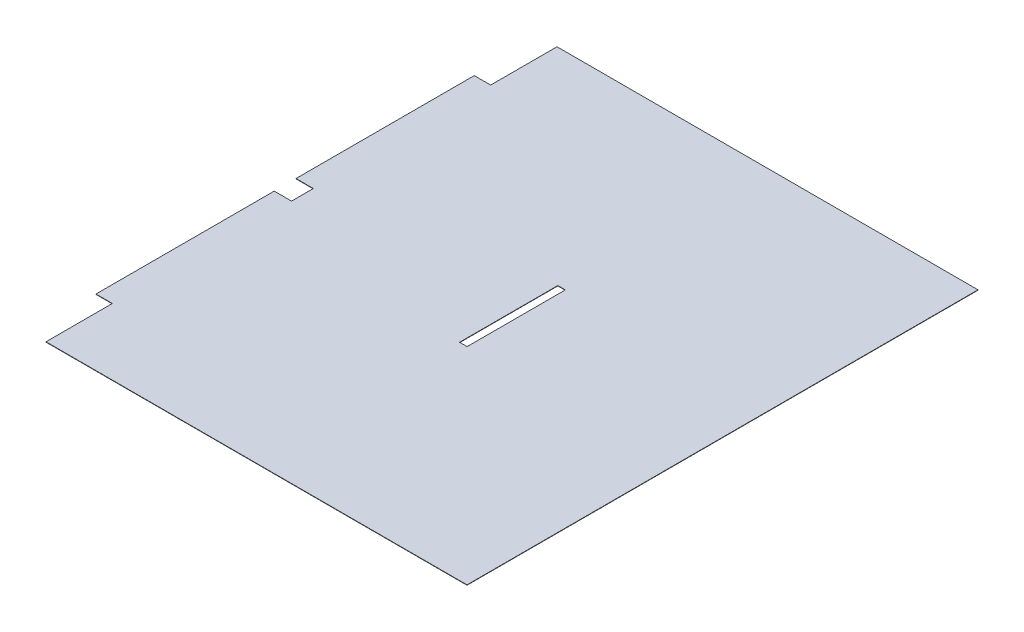
ISO-10303-21;
HEADER;
FILE_DESCRIPTION(('STEP AP214'),'2;1');
FILE_NAME('part.step','',(''),(''),'','','');
FILE_SCHEMA(('AUTOMOTIVE_DESIGN { 1 0 10303 214 1 1 1 1 }'));
ENDSEC;
DATA;
#1=APPLICATION_CONTEXT('core data for automotive mechanical design processes');
#2=APPLICATION_PROTOCOL_DEFINITION('international standard','automotive_design',2000,#1);
#3=PRODUCT_CONTEXT('',#1,'mechanical');
#4=PRODUCT('Part','Part','',(#3));
#5=PRODUCT_RELATED_PRODUCT_CATEGORY('part','',(#4));
#6=PRODUCT_DEFINITION_FORMATION('','',#4);
#7=PRODUCT_DEFINITION_CONTEXT('part definition',#1,'design');
#8=PRODUCT_DEFINITION('design','',#6,#7);
#9=PRODUCT_DEFINITION_SHAPE('','',#8);
#10=(LENGTH_UNIT() NAMED_UNIT(*) SI_UNIT(.MILLI.,.METRE.));
#11=(NAMED_UNIT(*) PLANE_ANGLE_UNIT() SI_UNIT($,.RADIAN.));
#12=(NAMED_UNIT(*) SI_UNIT($,.STERADIAN.) SOLID_ANGLE_UNIT());
#13=UNCERTAINTY_MEASURE_WITH_UNIT(LENGTH_MEASURE(1.E-05),#10,'distance_accuracy_value','');
#14=(GEOMETRIC_REPRESENTATION_CONTEXT(3) GLOBAL_UNCERTAINTY_ASSIGNED_CONTEXT((#13)) GLOBAL_UNIT_ASSIGNED_CONTEXT((#10,
#11,#12)) REPRESENTATION_CONTEXT('',''));
#15=CARTESIAN_POINT('',(0.,0.,0.));
#16=DIRECTION('',(0.,0.,1.));
#17=DIRECTION('',(1.,0.,0.));
#18=AXIS2_PLACEMENT_3D('',#15,#16,#17);
#19=CARTESIAN_POINT('',(0.,61.2,0.));
#20=DIRECTION('',(0.,-1.,0.));
#21=DIRECTION('',(0.,0.,-1.));
#22=AXIS2_PLACEMENT_3D('',#19,#20,#21);
#23=PLANE('',#22);
#24=DIRECTION('',(1.,0.,0.));
#25=VECTOR('',#24,1.);
#26=CARTESIAN_POINT('',(-125.,61.2,104.));
#27=LINE('',#26,#25);
#28=CARTESIAN_POINT('',(-125.,61.2,104.));
#29=VERTEX_POINT('',#28);
#30=CARTESIAN_POINT('',(-116.,61.2,104.));
#31=VERTEX_POINT('',#30);
#32=EDGE_CURVE('E192',#29,#31,#27,.T.);
#33=ORIENTED_EDGE('',*,*,#32,.T.);
#34=DIRECTION('',(0.,0.,1.));
#35=VECTOR('',#34,1.);
#36=CARTESIAN_POINT('',(-116.,61.2,104.));
#37=LINE('',#36,#35);
#38=CARTESIAN_POINT('',(-116.,61.2,140.475));
#39=VERTEX_POINT('',#38);
#40=EDGE_CURVE('E195',#31,#39,#37,.T.);
#41=ORIENTED_EDGE('',*,*,#40,.T.);
#42=DIRECTION('',(1.,0.,0.));
#43=VECTOR('',#42,1.);
#44=CARTESIAN_POINT('',(-116.,61.2,140.475));
#45=LINE('',#44,#43);
#46=CARTESIAN_POINT('',(115.475,61.2,140.475));
#47=VERTEX_POINT('',#46);
#48=EDGE_CURVE('E198',#39,#47,#45,.T.);
#49=ORIENTED_EDGE('',*,*,#48,.T.);
#50=DIRECTION('',(0.,0.,-1.));
#51=VECTOR('',#50,1.);
#52=CARTESIAN_POINT('',(115.475,61.2,-140.475));
#53=LINE('',#52,#51);
#54=CARTESIAN_POINT('',(115.475,61.2,-140.475));
#55=VERTEX_POINT('',#54);
#56=EDGE_CURVE('E200',#47,#55,#53,.T.);
#57=ORIENTED_EDGE('',*,*,#56,.T.);
#58=DIRECTION('',(-1.,0.,0.));
#59=VECTOR('',#58,1.);
#60=CARTESIAN_POINT('',(-116.,61.2,-140.475));
#61=LINE('',#60,#59);
#62=CARTESIAN_POINT('',(-116.,61.2,-140.475));
#63=VERTEX_POINT('',#62);
#64=EDGE_CURVE('E202',#55,#63,#61,.T.);
#65=ORIENTED_EDGE('',*,*,#64,.T.);
#66=DIRECTION('',(0.,0.,1.));
#67=VECTOR('',#66,1.);
#68=CARTESIAN_POINT('',(-116.,61.2,-104.));
#69=LINE('',#68,#67);
#70=CARTESIAN_POINT('',(-116.,61.2,-104.));
#71=VERTEX_POINT('',#70);
#72=EDGE_CURVE('E204',#63,#71,#69,.T.);
#73=ORIENTED_EDGE('',*,*,#72,.T.);
#74=DIRECTION('',(-1.,0.,0.));
#75=VECTOR('',#74,1.);
#76=CARTESIAN_POINT('',(-125.,61.2,-104.));
#77=LINE('',#76,#75);
#78=CARTESIAN_POINT('',(-125.,61.2,-104.));
#79=VERTEX_POINT('',#78);
#80=EDGE_CURVE('E206',#71,#79,#77,.T.);
#81=ORIENTED_EDGE('',*,*,#80,.T.);
#82=DIRECTION('',(0.,0.,1.));
#83=VECTOR('',#82,1.);
#84=CARTESIAN_POINT('',(-125.,61.2,-104.));
#85=LINE('',#84,#83);
#86=CARTESIAN_POINT('',(-125.,61.2,-5.99999999999994));
#87=VERTEX_POINT('',#86);
#88=EDGE_CURVE('E208',#79,#87,#85,.T.);
#89=ORIENTED_EDGE('',*,*,#88,.T.);
#90=DIRECTION('',(1.,0.,0.));
#91=VECTOR('',#90,1.);
#92=CARTESIAN_POINT('',(-125.,61.2,-5.99999999999994));
#93=LINE('',#92,#91);
#94=CARTESIAN_POINT('',(-115.475,61.2,-5.99999999999994));
#95=VERTEX_POINT('',#94);
#96=EDGE_CURVE('E210',#87,#95,#93,.T.);
#97=ORIENTED_EDGE('',*,*,#96,.T.);
#98=DIRECTION('',(0.,0.,1.));
#99=VECTOR('',#98,1.);
#100=CARTESIAN_POINT('',(-115.475,61.2,-5.99999999999994));
#101=LINE('',#100,#99);
#102=CARTESIAN_POINT('',(-115.475,61.2,6.00000000000006));
#103=VERTEX_POINT('',#102);
#104=EDGE_CURVE('E212',#95,#103,#101,.T.);
#105=ORIENTED_EDGE('',*,*,#104,.T.);
#106=DIRECTION('',(-1.,0.,0.));
#107=VECTOR('',#106,1.);
#108=CARTESIAN_POINT('',(-125.,61.2,6.00000000000006));
#109=LINE('',#108,#107);
#110=CARTESIAN_POINT('',(-125.,61.2,6.00000000000006));
#111=VERTEX_POINT('',#110);
#112=EDGE_CURVE('E214',#103,#111,#109,.T.);
#113=ORIENTED_EDGE('',*,*,#112,.T.);
#114=DIRECTION('',(0.,0.,1.));
#115=VECTOR('',#114,1.);
#116=CARTESIAN_POINT('',(-125.,61.2,6.00000000000006));
#117=LINE('',#116,#115);
#118=EDGE_CURVE('E216',#111,#29,#117,.T.);
#119=ORIENTED_EDGE('',*,*,#118,.T.);
#120=EDGE_LOOP('',(#33,#41,#49,#57,#65,#73,#81,#89,#97,#105,#113,#119));
#121=FACE_BOUND('',#120,.T.);
#122=DIRECTION('',(0.,0.,-1.));
#123=VECTOR('',#122,1.);
#124=CARTESIAN_POINT('',(2.075,61.2,-27.));
#125=LINE('',#124,#123);
#126=CARTESIAN_POINT('',(2.075,61.2,27.));
#127=VERTEX_POINT('',#126);
#128=CARTESIAN_POINT('',(2.075,61.2,-27.));
#129=VERTEX_POINT('',#128);
#130=EDGE_CURVE('E156',#127,#129,#125,.T.);
#131=ORIENTED_EDGE('',*,*,#130,.F.);
#132=DIRECTION('',(1.,0.,0.));
#133=VECTOR('',#132,1.);
#134=CARTESIAN_POINT('',(-2.075,61.2,27.));
#135=LINE('',#134,#133);
#136=CARTESIAN_POINT('',(-2.075,61.2,27.));
#137=VERTEX_POINT('',#136);
#138=EDGE_CURVE('E178',#137,#127,#135,.T.);
#139=ORIENTED_EDGE('',*,*,#138,.F.);
#140=DIRECTION('',(0.,0.,1.));
#141=VECTOR('',#140,1.);
#142=CARTESIAN_POINT('',(-2.075,61.2,-27.));
#143=LINE('',#142,#141);
#144=CARTESIAN_POINT('',(-2.075,61.2,-27.));
#145=VERTEX_POINT('',#144);
#146=EDGE_CURVE('E176',#145,#137,#143,.T.);
#147=ORIENTED_EDGE('',*,*,#146,.F.);
#148=DIRECTION('',(-1.,0.,0.));
#149=VECTOR('',#148,1.);
#150=CARTESIAN_POINT('',(-2.075,61.2,-27.));
#151=LINE('',#150,#149);
#152=EDGE_CURVE('E164',#129,#145,#151,.T.);
#153=ORIENTED_EDGE('',*,*,#152,.F.);
#154=EDGE_LOOP('',(#131,#139,#147,#153));
#155=FACE_BOUND('',#154,.T.);
#156=ADVANCED_FACE('F43',(#121,#155),#23,.F.);
#157=CARTESIAN_POINT('',(0.,61.,0.));
#158=DIRECTION('',(0.,-1.,0.));
#159=DIRECTION('',(0.,0.,-1.));
#160=AXIS2_PLACEMENT_3D('',#157,#158,#159);
#161=PLANE('',#160);
#162=DIRECTION('',(1.,0.,0.));
#163=VECTOR('',#162,1.);
#164=CARTESIAN_POINT('',(-125.,61.,104.));
#165=LINE('',#164,#163);
#166=CARTESIAN_POINT('',(-125.,61.,104.));
#167=VERTEX_POINT('',#166);
#168=CARTESIAN_POINT('',(-116.,61.,104.));
#169=VERTEX_POINT('',#168);
#170=EDGE_CURVE('E172',#167,#169,#165,.T.);
#171=ORIENTED_EDGE('',*,*,#170,.F.);
#172=DIRECTION('',(0.,0.,1.));
#173=VECTOR('',#172,1.);
#174=CARTESIAN_POINT('',(-125.,61.,6.00000000000006));
#175=LINE('',#174,#173);
#176=CARTESIAN_POINT('',(-125.,61.,6.00000000000006));
#177=VERTEX_POINT('',#176);
#178=EDGE_CURVE('E196',#177,#167,#175,.T.);
#179=ORIENTED_EDGE('',*,*,#178,.F.);
#180=DIRECTION('',(-1.,0.,0.));
#181=VECTOR('',#180,1.);
#182=CARTESIAN_POINT('',(-125.,61.,6.00000000000006));
#183=LINE('',#182,#181);
#184=CARTESIAN_POINT('',(-115.475,61.,6.00000000000006));
#185=VERTEX_POINT('',#184);
#186=EDGE_CURVE('E239',#185,#177,#183,.T.);
#187=ORIENTED_EDGE('',*,*,#186,.F.);
#188=DIRECTION('',(0.,0.,1.));
#189=VECTOR('',#188,1.);
#190=CARTESIAN_POINT('',(-115.475,61.,-5.99999999999994));
#191=LINE('',#190,#189);
#192=CARTESIAN_POINT('',(-115.475,61.,-5.99999999999994));
#193=VERTEX_POINT('',#192);
#194=EDGE_CURVE('E237',#193,#185,#191,.T.);
#195=ORIENTED_EDGE('',*,*,#194,.F.);
#196=DIRECTION('',(1.,0.,0.));
#197=VECTOR('',#196,1.);
#198=CARTESIAN_POINT('',(-125.,61.,-5.99999999999994));
#199=LINE('',#198,#197);
#200=CARTESIAN_POINT('',(-125.,61.,-5.99999999999994));
#201=VERTEX_POINT('',#200);
#202=EDGE_CURVE('E235',#201,#193,#199,.T.);
#203=ORIENTED_EDGE('',*,*,#202,.F.);
#204=DIRECTION('',(0.,0.,1.));
#205=VECTOR('',#204,1.);
#206=CARTESIAN_POINT('',(-125.,61.,-104.));
#207=LINE('',#206,#205);
#208=CARTESIAN_POINT('',(-125.,61.,-104.));
#209=VERTEX_POINT('',#208);
#210=EDGE_CURVE('E233',#209,#201,#207,.T.);
#211=ORIENTED_EDGE('',*,*,#210,.F.);
#212=DIRECTION('',(-1.,0.,0.));
#213=VECTOR('',#212,1.);
#214=CARTESIAN_POINT('',(-125.,61.,-104.));
#215=LINE('',#214,#213);
#216=CARTESIAN_POINT('',(-116.,61.,-104.));
#217=VERTEX_POINT('',#216);
#218=EDGE_CURVE('E231',#217,#209,#215,.T.);
#219=ORIENTED_EDGE('',*,*,#218,.F.);
#220=DIRECTION('',(0.,0.,1.));
#221=VECTOR('',#220,1.);
#222=CARTESIAN_POINT('',(-116.,61.,-104.));
#223=LINE('',#222,#221);
#224=CARTESIAN_POINT('',(-116.,61.,-140.475));
#225=VERTEX_POINT('',#224);
#226=EDGE_CURVE('E229',#225,#217,#223,.T.);
#227=ORIENTED_EDGE('',*,*,#226,.F.);
#228=DIRECTION('',(-1.,0.,0.));
#229=VECTOR('',#228,1.);
#230=CARTESIAN_POINT('',(-116.,61.,-140.475));
#231=LINE('',#230,#229);
#232=CARTESIAN_POINT('',(115.475,61.,-140.475));
#233=VERTEX_POINT('',#232);
#234=EDGE_CURVE('E227',#233,#225,#231,.T.);
#235=ORIENTED_EDGE('',*,*,#234,.F.);
#236=DIRECTION('',(0.,0.,-1.));
#237=VECTOR('',#236,1.);
#238=CARTESIAN_POINT('',(115.475,61.,-140.475));
#239=LINE('',#238,#237);
#240=CARTESIAN_POINT('',(115.475,61.,140.475));
#241=VERTEX_POINT('',#240);
#242=EDGE_CURVE('E225',#241,#233,#239,.T.);
#243=ORIENTED_EDGE('',*,*,#242,.F.);
#244=DIRECTION('',(1.,0.,0.));
#245=VECTOR('',#244,1.);
#246=CARTESIAN_POINT('',(-116.,61.,140.475));
#247=LINE('',#246,#245);
#248=CARTESIAN_POINT('',(-116.,61.,140.475));
#249=VERTEX_POINT('',#248);
#250=EDGE_CURVE('E223',#249,#241,#247,.T.);
#251=ORIENTED_EDGE('',*,*,#250,.F.);
#252=DIRECTION('',(0.,0.,1.));
#253=VECTOR('',#252,1.);
#254=CARTESIAN_POINT('',(-116.,61.,104.));
#255=LINE('',#254,#253);
#256=EDGE_CURVE('E221',#169,#249,#255,.T.);
#257=ORIENTED_EDGE('',*,*,#256,.F.);
#258=EDGE_LOOP('',(#171,#179,#187,#195,#203,#211,#219,#227,#235,#243,#251,#257));
#259=FACE_BOUND('',#258,.T.);
#260=DIRECTION('',(1.,0.,0.));
#261=VECTOR('',#260,1.);
#262=CARTESIAN_POINT('',(-2.075,61.,27.));
#263=LINE('',#262,#261);
#264=CARTESIAN_POINT('',(-2.075,61.,27.));
#265=VERTEX_POINT('',#264);
#266=CARTESIAN_POINT('',(2.075,61.,27.));
#267=VERTEX_POINT('',#266);
#268=EDGE_CURVE('E165',#265,#267,#263,.T.);
#269=ORIENTED_EDGE('',*,*,#268,.T.);
#270=DIRECTION('',(0.,0.,-1.));
#271=VECTOR('',#270,1.);
#272=CARTESIAN_POINT('',(2.075,61.,-27.));
#273=LINE('',#272,#271);
#274=CARTESIAN_POINT('',(2.075,61.,-27.));
#275=VERTEX_POINT('',#274);
#276=EDGE_CURVE('E66',#267,#275,#273,.T.);
#277=ORIENTED_EDGE('',*,*,#276,.T.);
#278=DIRECTION('',(-1.,0.,0.));
#279=VECTOR('',#278,1.);
#280=CARTESIAN_POINT('',(-2.075,61.,-27.));
#281=LINE('',#280,#279);
#282=CARTESIAN_POINT('',(-2.075,61.,-27.));
#283=VERTEX_POINT('',#282);
#284=EDGE_CURVE('E171',#275,#283,#281,.T.);
#285=ORIENTED_EDGE('',*,*,#284,.T.);
#286=DIRECTION('',(0.,0.,1.));
#287=VECTOR('',#286,1.);
#288=CARTESIAN_POINT('',(-2.075,61.,-27.));
#289=LINE('',#288,#287);
#290=EDGE_CURVE('E184',#283,#265,#289,.T.);
#291=ORIENTED_EDGE('',*,*,#290,.T.);
#292=EDGE_LOOP('',(#269,#277,#285,#291));
#293=FACE_BOUND('',#292,.T.);
#294=ADVANCED_FACE('F281',(#259,#293),#161,.T.);
#295=CARTESIAN_POINT('',(-125.,61.2,104.));
#296=DIRECTION('',(0.,0.,-1.));
#297=DIRECTION('',(-1.,0.,0.));
#298=AXIS2_PLACEMENT_3D('',#295,#296,#297);
#299=PLANE('',#298);
#300=ORIENTED_EDGE('',*,*,#170,.T.);
#301=DIRECTION('',(0.,-1.,0.));
#302=VECTOR('',#301,1.);
#303=CARTESIAN_POINT('',(-116.,61.2,104.));
#304=LINE('',#303,#302);
#305=EDGE_CURVE('E11',#31,#169,#304,.T.);
#306=ORIENTED_EDGE('',*,*,#305,.F.);
#307=ORIENTED_EDGE('',*,*,#32,.F.);
#308=DIRECTION('',(0.,-1.,0.));
#309=VECTOR('',#308,1.);
#310=CARTESIAN_POINT('',(-125.,61.2,104.));
#311=LINE('',#310,#309);
#312=EDGE_CURVE('E218',#29,#167,#311,.T.);
#313=ORIENTED_EDGE('',*,*,#312,.T.);
#314=EDGE_LOOP('',(#300,#306,#307,#313));
#315=FACE_BOUND('',#314,.T.);
#316=ADVANCED_FACE('F45',(#315),#299,.F.);
#317=CARTESIAN_POINT('',(-116.,61.2,104.));
#318=DIRECTION('',(1.,0.,0.));
#319=DIRECTION('',(0.,0.,-1.));
#320=AXIS2_PLACEMENT_3D('',#317,#318,#319);
#321=PLANE('',#320);
#322=ORIENTED_EDGE('',*,*,#256,.T.);
#323=DIRECTION('',(0.,-1.,0.));
#324=VECTOR('',#323,1.);
#325=CARTESIAN_POINT('',(-116.,61.2,140.475));
#326=LINE('',#325,#324);
#327=EDGE_CURVE('E51',#39,#249,#326,.T.);
#328=ORIENTED_EDGE('',*,*,#327,.F.);
#329=ORIENTED_EDGE('',*,*,#40,.F.);
#330=ORIENTED_EDGE('',*,*,#305,.T.);
#331=EDGE_LOOP('',(#322,#328,#329,#330));
#332=FACE_BOUND('',#331,.T.);
#333=ADVANCED_FACE('F298',(#332),#321,.F.);
#334=CARTESIAN_POINT('',(-116.,61.2,140.475));
#335=DIRECTION('',(0.,0.,-1.));
#336=DIRECTION('',(-1.,0.,0.));
#337=AXIS2_PLACEMENT_3D('',#334,#335,#336);
#338=PLANE('',#337);
#339=ORIENTED_EDGE('',*,*,#250,.T.);
#340=DIRECTION('',(0.,-1.,0.));
#341=VECTOR('',#340,1.);
#342=CARTESIAN_POINT('',(115.475,61.2,140.475));
#343=LINE('',#342,#341);
#344=EDGE_CURVE('E268',#47,#241,#343,.T.);
#345=ORIENTED_EDGE('',*,*,#344,.F.);
#346=ORIENTED_EDGE('',*,*,#48,.F.);
#347=ORIENTED_EDGE('',*,*,#327,.T.);
#348=EDGE_LOOP('',(#339,#345,#346,#347));
#349=FACE_BOUND('',#348,.T.);
#350=ADVANCED_FACE('F275',(#349),#338,.F.);
#351=CARTESIAN_POINT('',(115.475,61.2,-140.475));
#352=DIRECTION('',(-1.,0.,0.));
#353=DIRECTION('',(0.,0.,1.));
#354=AXIS2_PLACEMENT_3D('',#351,#352,#353);
#355=PLANE('',#354);
#356=ORIENTED_EDGE('',*,*,#242,.T.);
#357=DIRECTION('',(0.,-1.,0.));
#358=VECTOR('',#357,1.);
#359=CARTESIAN_POINT('',(115.475,61.2,-140.475));
#360=LINE('',#359,#358);
#361=EDGE_CURVE('E265',#55,#233,#360,.T.);
#362=ORIENTED_EDGE('',*,*,#361,.F.);
#363=ORIENTED_EDGE('',*,*,#56,.F.);
#364=ORIENTED_EDGE('',*,*,#344,.T.);
#365=EDGE_LOOP('',(#356,#362,#363,#364));
#366=FACE_BOUND('',#365,.T.);
#367=ADVANCED_FACE('F287',(#366),#355,.F.);
#368=CARTESIAN_POINT('',(-116.,61.2,-140.475));
#369=DIRECTION('',(0.,0.,1.));
#370=DIRECTION('',(1.,0.,0.));
#371=AXIS2_PLACEMENT_3D('',#368,#369,#370);
#372=PLANE('',#371);
#373=ORIENTED_EDGE('',*,*,#234,.T.);
#374=DIRECTION('',(0.,-1.,0.));
#375=VECTOR('',#374,1.);
#376=CARTESIAN_POINT('',(-116.,61.2,-140.475));
#377=LINE('',#376,#375);
#378=EDGE_CURVE('E262',#63,#225,#377,.T.);
#379=ORIENTED_EDGE('',*,*,#378,.F.);
#380=ORIENTED_EDGE('',*,*,#64,.F.);
#381=ORIENTED_EDGE('',*,*,#361,.T.);
#382=EDGE_LOOP('',(#373,#379,#380,#381));
#383=FACE_BOUND('',#382,.T.);
#384=ADVANCED_FACE('F291',(#383),#372,.F.);
#385=CARTESIAN_POINT('',(-116.,61.2,-104.));
#386=DIRECTION('',(1.,0.,0.));
#387=DIRECTION('',(0.,0.,-1.));
#388=AXIS2_PLACEMENT_3D('',#385,#386,#387);
#389=PLANE('',#388);
#390=ORIENTED_EDGE('',*,*,#226,.T.);
#391=DIRECTION('',(0.,-1.,0.));
#392=VECTOR('',#391,1.);
#393=CARTESIAN_POINT('',(-116.,61.2,-104.));
#394=LINE('',#393,#392);
#395=EDGE_CURVE('E259',#71,#217,#394,.T.);
#396=ORIENTED_EDGE('',*,*,#395,.F.);
#397=ORIENTED_EDGE('',*,*,#72,.F.);
#398=ORIENTED_EDGE('',*,*,#378,.T.);
#399=EDGE_LOOP('',(#390,#396,#397,#398));
#400=FACE_BOUND('',#399,.T.);
#401=ADVANCED_FACE('F331',(#400),#389,.F.);
#402=CARTESIAN_POINT('',(-125.,61.2,-104.));
#403=DIRECTION('',(0.,0.,1.));
#404=DIRECTION('',(1.,0.,0.));
#405=AXIS2_PLACEMENT_3D('',#402,#403,#404);
#406=PLANE('',#405);
#407=ORIENTED_EDGE('',*,*,#218,.T.);
#408=DIRECTION('',(0.,-1.,0.));
#409=VECTOR('',#408,1.);
#410=CARTESIAN_POINT('',(-125.,61.2,-104.));
#411=LINE('',#410,#409);
#412=EDGE_CURVE('E256',#79,#209,#411,.T.);
#413=ORIENTED_EDGE('',*,*,#412,.F.);
#414=ORIENTED_EDGE('',*,*,#80,.F.);
#415=ORIENTED_EDGE('',*,*,#395,.T.);
#416=EDGE_LOOP('',(#407,#413,#414,#415));
#417=FACE_BOUND('',#416,.T.);
#418=ADVANCED_FACE('F329',(#417),#406,.F.);
#419=CARTESIAN_POINT('',(-125.,61.2,-104.));
#420=DIRECTION('',(1.,0.,0.));
#421=DIRECTION('',(0.,0.,-1.));
#422=AXIS2_PLACEMENT_3D('',#419,#420,#421);
#423=PLANE('',#422);
#424=ORIENTED_EDGE('',*,*,#210,.T.);
#425=DIRECTION('',(0.,-1.,0.));
#426=VECTOR('',#425,1.);
#427=CARTESIAN_POINT('',(-125.,61.2,-5.99999999999994));
#428=LINE('',#427,#426);
#429=EDGE_CURVE('E253',#87,#201,#428,.T.);
#430=ORIENTED_EDGE('',*,*,#429,.F.);
#431=ORIENTED_EDGE('',*,*,#88,.F.);
#432=ORIENTED_EDGE('',*,*,#412,.T.);
#433=EDGE_LOOP('',(#424,#430,#431,#432));
#434=FACE_BOUND('',#433,.T.);
#435=ADVANCED_FACE('F325',(#434),#423,.F.);
#436=CARTESIAN_POINT('',(-125.,61.2,-5.99999999999994));
#437=DIRECTION('',(0.,0.,-1.));
#438=DIRECTION('',(-1.,0.,0.));
#439=AXIS2_PLACEMENT_3D('',#436,#437,#438);
#440=PLANE('',#439);
#441=ORIENTED_EDGE('',*,*,#202,.T.);
#442=DIRECTION('',(0.,-1.,0.));
#443=VECTOR('',#442,1.);
#444=CARTESIAN_POINT('',(-115.475,61.2,-5.99999999999994));
#445=LINE('',#444,#443);
#446=EDGE_CURVE('E250',#95,#193,#445,.T.);
#447=ORIENTED_EDGE('',*,*,#446,.F.);
#448=ORIENTED_EDGE('',*,*,#96,.F.);
#449=ORIENTED_EDGE('',*,*,#429,.T.);
#450=EDGE_LOOP('',(#441,#447,#448,#449));
#451=FACE_BOUND('',#450,.T.);
#452=ADVANCED_FACE('F320',(#451),#440,.F.);
#453=CARTESIAN_POINT('',(-115.475,61.2,-5.99999999999994));
#454=DIRECTION('',(1.,0.,0.));
#455=DIRECTION('',(0.,0.,-1.));
#456=AXIS2_PLACEMENT_3D('',#453,#454,#455);
#457=PLANE('',#456);
#458=ORIENTED_EDGE('',*,*,#194,.T.);
#459=DIRECTION('',(0.,-1.,0.));
#460=VECTOR('',#459,1.);
#461=CARTESIAN_POINT('',(-115.475,61.2,6.00000000000006));
#462=LINE('',#461,#460);
#463=EDGE_CURVE('E247',#103,#185,#462,.T.);
#464=ORIENTED_EDGE('',*,*,#463,.F.);
#465=ORIENTED_EDGE('',*,*,#104,.F.);
#466=ORIENTED_EDGE('',*,*,#446,.T.);
#467=EDGE_LOOP('',(#458,#464,#465,#466));
#468=FACE_BOUND('',#467,.T.);
#469=ADVANCED_FACE('F314',(#468),#457,.F.);
#470=CARTESIAN_POINT('',(-125.,61.2,6.00000000000006));
#471=DIRECTION('',(0.,0.,1.));
#472=DIRECTION('',(1.,0.,0.));
#473=AXIS2_PLACEMENT_3D('',#470,#471,#472);
#474=PLANE('',#473);
#475=ORIENTED_EDGE('',*,*,#186,.T.);
#476=DIRECTION('',(0.,-1.,0.));
#477=VECTOR('',#476,1.);
#478=CARTESIAN_POINT('',(-125.,61.2,6.00000000000006));
#479=LINE('',#478,#477);
#480=EDGE_CURVE('E244',#111,#177,#479,.T.);
#481=ORIENTED_EDGE('',*,*,#480,.F.);
#482=ORIENTED_EDGE('',*,*,#112,.F.);
#483=ORIENTED_EDGE('',*,*,#463,.T.);
#484=EDGE_LOOP('',(#475,#481,#482,#483));
#485=FACE_BOUND('',#484,.T.);
#486=ADVANCED_FACE('F310',(#485),#474,.F.);
#487=CARTESIAN_POINT('',(-125.,61.2,6.00000000000006));
#488=DIRECTION('',(1.,0.,0.));
#489=DIRECTION('',(0.,0.,-1.));
#490=AXIS2_PLACEMENT_3D('',#487,#488,#489);
#491=PLANE('',#490);
#492=ORIENTED_EDGE('',*,*,#178,.T.);
#493=ORIENTED_EDGE('',*,*,#312,.F.);
#494=ORIENTED_EDGE('',*,*,#118,.F.);
#495=ORIENTED_EDGE('',*,*,#480,.T.);
#496=EDGE_LOOP('',(#492,#493,#494,#495));
#497=FACE_BOUND('',#496,.T.);
#498=ADVANCED_FACE('F305',(#497),#491,.F.);
#499=CARTESIAN_POINT('',(2.075,61.2,-27.));
#500=DIRECTION('',(-1.,0.,0.));
#501=DIRECTION('',(0.,0.,1.));
#502=AXIS2_PLACEMENT_3D('',#499,#500,#501);
#503=PLANE('',#502);
#504=ORIENTED_EDGE('',*,*,#276,.F.);
#505=DIRECTION('',(0.,-1.,0.));
#506=VECTOR('',#505,1.);
#507=CARTESIAN_POINT('',(2.075,61.2,27.));
#508=LINE('',#507,#506);
#509=EDGE_CURVE('E160',#127,#267,#508,.T.);
#510=ORIENTED_EDGE('',*,*,#509,.F.);
#511=ORIENTED_EDGE('',*,*,#130,.T.);
#512=DIRECTION('',(0.,-1.,0.));
#513=VECTOR('',#512,1.);
#514=CARTESIAN_POINT('',(2.075,61.2,-27.));
#515=LINE('',#514,#513);
#516=EDGE_CURVE('E159',#129,#275,#515,.T.);
#517=ORIENTED_EDGE('',*,*,#516,.T.);
#518=EDGE_LOOP('',(#504,#510,#511,#517));
#519=FACE_BOUND('',#518,.T.);
#520=ADVANCED_FACE('F158',(#519),#503,.T.);
#521=CARTESIAN_POINT('',(-2.075,61.2,-27.));
#522=DIRECTION('',(0.,0.,1.));
#523=DIRECTION('',(1.,0.,0.));
#524=AXIS2_PLACEMENT_3D('',#521,#522,#523);
#525=PLANE('',#524);
#526=ORIENTED_EDGE('',*,*,#284,.F.);
#527=ORIENTED_EDGE('',*,*,#516,.F.);
#528=ORIENTED_EDGE('',*,*,#152,.T.);
#529=DIRECTION('',(0.,-1.,0.));
#530=VECTOR('',#529,1.);
#531=CARTESIAN_POINT('',(-2.075,61.2,-27.));
#532=LINE('',#531,#530);
#533=EDGE_CURVE('E173',#145,#283,#532,.T.);
#534=ORIENTED_EDGE('',*,*,#533,.T.);
#535=EDGE_LOOP('',(#526,#527,#528,#534));
#536=FACE_BOUND('',#535,.T.);
#537=ADVANCED_FACE('F168',(#536),#525,.T.);
#538=CARTESIAN_POINT('',(-2.075,61.2,-27.));
#539=DIRECTION('',(1.,0.,0.));
#540=DIRECTION('',(0.,0.,-1.));
#541=AXIS2_PLACEMENT_3D('',#538,#539,#540);
#542=PLANE('',#541);
#543=ORIENTED_EDGE('',*,*,#290,.F.);
#544=ORIENTED_EDGE('',*,*,#533,.F.);
#545=ORIENTED_EDGE('',*,*,#146,.T.);
#546=DIRECTION('',(0.,-1.,0.));
#547=VECTOR('',#546,1.);
#548=CARTESIAN_POINT('',(-2.075,61.2,27.));
#549=LINE('',#548,#547);
#550=EDGE_CURVE('E58',#137,#265,#549,.T.);
#551=ORIENTED_EDGE('',*,*,#550,.T.);
#552=EDGE_LOOP('',(#543,#544,#545,#551));
#553=FACE_BOUND('',#552,.T.);
#554=ADVANCED_FACE('F395',(#553),#542,.T.);
#555=CARTESIAN_POINT('',(-2.075,61.2,27.));
#556=DIRECTION('',(0.,0.,-1.));
#557=DIRECTION('',(-1.,0.,0.));
#558=AXIS2_PLACEMENT_3D('',#555,#556,#557);
#559=PLANE('',#558);
#560=ORIENTED_EDGE('',*,*,#268,.F.);
#561=ORIENTED_EDGE('',*,*,#550,.F.);
#562=ORIENTED_EDGE('',*,*,#138,.T.);
#563=ORIENTED_EDGE('',*,*,#509,.T.);
#564=EDGE_LOOP('',(#560,#561,#562,#563));
#565=FACE_BOUND('',#564,.T.);
#566=ADVANCED_FACE('F402',(#565),#559,.T.);
#567=CLOSED_SHELL('',(#156,#294,#316,#333,#350,#367,#384,#401,#418,#435,#452,#469,#486,#498,
#520,#537,#554,#566));
#568=MANIFOLD_SOLID_BREP('B2',#567);
#569=ADVANCED_BREP_SHAPE_REPRESENTATION('',(#18,#568),#14);
#570=SHAPE_DEFINITION_REPRESENTATION(#9,#569);
ENDSEC;
END-ISO-10303-21;
